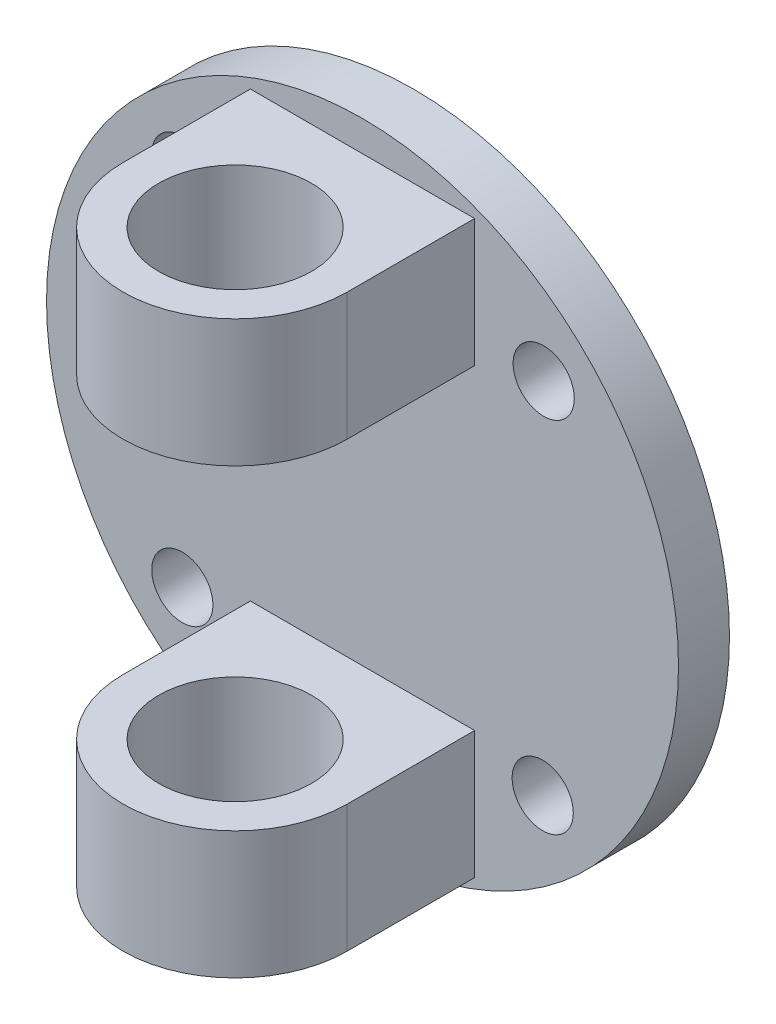
ISO-10303-21;
HEADER;
FILE_DESCRIPTION(('STEP AP214'),'2;1');
FILE_NAME('part.step','',(''),(''),'','','');
FILE_SCHEMA(('AUTOMOTIVE_DESIGN { 1 0 10303 214 1 1 1 1 }'));
ENDSEC;
DATA;
#1=APPLICATION_CONTEXT('core data for automotive mechanical design processes');
#2=APPLICATION_PROTOCOL_DEFINITION('international standard','automotive_design',2000,#1);
#3=PRODUCT_CONTEXT('',#1,'mechanical');
#4=PRODUCT('Part','Part','',(#3));
#5=PRODUCT_RELATED_PRODUCT_CATEGORY('part','',(#4));
#6=PRODUCT_DEFINITION_FORMATION('','',#4);
#7=PRODUCT_DEFINITION_CONTEXT('part definition',#1,'design');
#8=PRODUCT_DEFINITION('design','',#6,#7);
#9=PRODUCT_DEFINITION_SHAPE('','',#8);
#10=(LENGTH_UNIT() NAMED_UNIT(*) SI_UNIT(.MILLI.,.METRE.));
#11=(NAMED_UNIT(*) PLANE_ANGLE_UNIT() SI_UNIT($,.RADIAN.));
#12=(NAMED_UNIT(*) SI_UNIT($,.STERADIAN.) SOLID_ANGLE_UNIT());
#13=UNCERTAINTY_MEASURE_WITH_UNIT(LENGTH_MEASURE(1.E-05),#10,'distance_accuracy_value','');
#14=(GEOMETRIC_REPRESENTATION_CONTEXT(3) GLOBAL_UNCERTAINTY_ASSIGNED_CONTEXT((#13)) GLOBAL_UNIT_ASSIGNED_CONTEXT((#10,
#11,#12)) REPRESENTATION_CONTEXT('',''));
#15=CARTESIAN_POINT('',(0.,0.,0.));
#16=DIRECTION('',(0.,0.,1.));
#17=DIRECTION('',(1.,0.,0.));
#18=AXIS2_PLACEMENT_3D('',#15,#16,#17);
#19=CARTESIAN_POINT('',(0.,0.,10.));
#20=DIRECTION('',(0.,0.,1.));
#21=DIRECTION('',(1.,0.,0.));
#22=AXIS2_PLACEMENT_3D('',#19,#20,#21);
#23=PLANE('',#22);
#24=CARTESIAN_POINT('',(35.5489085942564,35.1607038859748,10.));
#25=DIRECTION('',(0.,0.,1.));
#26=DIRECTION('',(1.,0.,0.));
#27=AXIS2_PLACEMENT_3D('',#24,#25,#26);
#28=CIRCLE('',#27,6.);
#29=CARTESIAN_POINT('',(41.5489085942564,35.1607038859748,10.));
#30=VERTEX_POINT('',#29);
#31=EDGE_CURVE('E225',#30,#30,#28,.T.);
#32=ORIENTED_EDGE('',*,*,#31,.F.);
#33=EDGE_LOOP('',(#32));
#34=FACE_BOUND('',#33,.T.);
#35=CARTESIAN_POINT('',(-35.3553390593276,35.3553390593272,10.));
#36=DIRECTION('',(0.,0.,1.));
#37=DIRECTION('',(1.,0.,0.));
#38=AXIS2_PLACEMENT_3D('',#35,#36,#37);
#39=CIRCLE('',#38,6.);
#40=CARTESIAN_POINT('',(-29.3553390593276,35.3553390593272,10.));
#41=VERTEX_POINT('',#40);
#42=EDGE_CURVE('E217',#41,#41,#39,.T.);
#43=ORIENTED_EDGE('',*,*,#42,.F.);
#44=EDGE_LOOP('',(#43));
#45=FACE_BOUND('',#44,.T.);
#46=CARTESIAN_POINT('',(-35.3553390593271,-35.3553390593277,10.));
#47=DIRECTION('',(0.,0.,1.));
#48=DIRECTION('',(1.,0.,0.));
#49=AXIS2_PLACEMENT_3D('',#46,#47,#48);
#50=CIRCLE('',#49,6.);
#51=CARTESIAN_POINT('',(-29.3553390593271,-35.3553390593277,10.));
#52=VERTEX_POINT('',#51);
#53=EDGE_CURVE('E208',#52,#52,#50,.T.);
#54=ORIENTED_EDGE('',*,*,#53,.F.);
#55=EDGE_LOOP('',(#54));
#56=FACE_BOUND('',#55,.T.);
#57=CARTESIAN_POINT('',(35.3553390593277,-35.3553390593271,10.));
#58=DIRECTION('',(0.,0.,1.));
#59=DIRECTION('',(1.,0.,0.));
#60=AXIS2_PLACEMENT_3D('',#57,#58,#59);
#61=CIRCLE('',#60,6.);
#62=CARTESIAN_POINT('',(41.3553390593277,-35.3553390593271,10.));
#63=VERTEX_POINT('',#62);
#64=EDGE_CURVE('E212',#63,#63,#61,.T.);
#65=ORIENTED_EDGE('',*,*,#64,.F.);
#66=EDGE_LOOP('',(#65));
#67=FACE_BOUND('',#66,.T.);
#68=CARTESIAN_POINT('',(0.,0.,10.));
#69=DIRECTION('',(0.,0.,1.));
#70=DIRECTION('',(1.,0.,0.));
#71=AXIS2_PLACEMENT_3D('',#68,#69,#70);
#72=CIRCLE('',#71,62.);
#73=CARTESIAN_POINT('',(62.,0.,10.));
#74=VERTEX_POINT('',#73);
#75=EDGE_CURVE('E11',#74,#74,#72,.T.);
#76=ORIENTED_EDGE('',*,*,#75,.T.);
#77=EDGE_LOOP('',(#76));
#78=FACE_BOUND('',#77,.T.);
#79=DIRECTION('',(1.,0.,0.));
#80=VECTOR('',#79,1.);
#81=CARTESIAN_POINT('',(-22.,-56.,10.));
#82=LINE('',#81,#80);
#83=CARTESIAN_POINT('',(-22.,-56.,10.));
#84=VERTEX_POINT('',#83);
#85=CARTESIAN_POINT('',(22.,-56.,10.));
#86=VERTEX_POINT('',#85);
#87=EDGE_CURVE('E125',#84,#86,#82,.T.);
#88=ORIENTED_EDGE('',*,*,#87,.F.);
#89=DIRECTION('',(0.,-1.,0.));
#90=VECTOR('',#89,1.);
#91=CARTESIAN_POINT('',(-22.,-31.,10.));
#92=LINE('',#91,#90);
#93=CARTESIAN_POINT('',(-22.,-31.,10.));
#94=VERTEX_POINT('',#93);
#95=EDGE_CURVE('E180',#94,#84,#92,.T.);
#96=ORIENTED_EDGE('',*,*,#95,.F.);
#97=DIRECTION('',(-1.,0.,0.));
#98=VECTOR('',#97,1.);
#99=CARTESIAN_POINT('',(22.,-31.,10.));
#100=LINE('',#99,#98);
#101=CARTESIAN_POINT('',(22.,-31.,10.));
#102=VERTEX_POINT('',#101);
#103=EDGE_CURVE('E188',#102,#94,#100,.T.);
#104=ORIENTED_EDGE('',*,*,#103,.F.);
#105=DIRECTION('',(0.,1.,0.));
#106=VECTOR('',#105,1.);
#107=CARTESIAN_POINT('',(22.,-56.,10.));
#108=LINE('',#107,#106);
#109=EDGE_CURVE('E195',#86,#102,#108,.T.);
#110=ORIENTED_EDGE('',*,*,#109,.F.);
#111=EDGE_LOOP('',(#88,#96,#104,#110));
#112=FACE_BOUND('',#111,.T.);
#113=DIRECTION('',(0.,1.,0.));
#114=VECTOR('',#113,1.);
#115=CARTESIAN_POINT('',(22.,31.,10.));
#116=LINE('',#115,#114);
#117=CARTESIAN_POINT('',(22.,31.,10.));
#118=VERTEX_POINT('',#117);
#119=CARTESIAN_POINT('',(22.,56.,10.));
#120=VERTEX_POINT('',#119);
#121=EDGE_CURVE('E173',#118,#120,#116,.T.);
#122=ORIENTED_EDGE('',*,*,#121,.F.);
#123=DIRECTION('',(1.,0.,0.));
#124=VECTOR('',#123,1.);
#125=CARTESIAN_POINT('',(-22.,31.,10.));
#126=LINE('',#125,#124);
#127=CARTESIAN_POINT('',(-22.,31.,10.));
#128=VERTEX_POINT('',#127);
#129=EDGE_CURVE('E176',#128,#118,#126,.T.);
#130=ORIENTED_EDGE('',*,*,#129,.F.);
#131=DIRECTION('',(0.,-1.,0.));
#132=VECTOR('',#131,1.);
#133=CARTESIAN_POINT('',(-22.,31.,10.));
#134=LINE('',#133,#132);
#135=CARTESIAN_POINT('',(-22.,56.,10.));
#136=VERTEX_POINT('',#135);
#137=EDGE_CURVE('E166',#136,#128,#134,.T.);
#138=ORIENTED_EDGE('',*,*,#137,.F.);
#139=DIRECTION('',(-1.,0.,0.));
#140=VECTOR('',#139,1.);
#141=CARTESIAN_POINT('',(22.,56.,10.));
#142=LINE('',#141,#140);
#143=EDGE_CURVE('E169',#120,#136,#142,.T.);
#144=ORIENTED_EDGE('',*,*,#143,.F.);
#145=EDGE_LOOP('',(#122,#130,#138,#144));
#146=FACE_BOUND('',#145,.T.);
#147=ADVANCED_FACE('F42',(#34,#45,#56,#67,#78,#112,#146),#23,.T.);
#148=CARTESIAN_POINT('',(0.,0.,10.));
#149=DIRECTION('',(0.,0.,-1.));
#150=DIRECTION('',(-1.,0.,0.));
#151=AXIS2_PLACEMENT_3D('',#148,#149,#150);
#152=CYLINDRICAL_SURFACE('',#151,62.);
#153=ORIENTED_EDGE('',*,*,#75,.F.);
#154=EDGE_LOOP('',(#153));
#155=FACE_BOUND('',#154,.T.);
#156=CARTESIAN_POINT('',(0.,0.,0.));
#157=DIRECTION('',(0.,0.,1.));
#158=DIRECTION('',(1.,0.,0.));
#159=AXIS2_PLACEMENT_3D('',#156,#157,#158);
#160=CIRCLE('',#159,62.);
#161=CARTESIAN_POINT('',(62.,0.,0.));
#162=VERTEX_POINT('',#161);
#163=EDGE_CURVE('E46',#162,#162,#160,.T.);
#164=ORIENTED_EDGE('',*,*,#163,.T.);
#165=EDGE_LOOP('',(#164));
#166=FACE_BOUND('',#165,.T.);
#167=ADVANCED_FACE('F44',(#155,#166),#152,.T.);
#168=CARTESIAN_POINT('',(0.,0.,0.));
#169=DIRECTION('',(0.,0.,1.));
#170=DIRECTION('',(1.,0.,0.));
#171=AXIS2_PLACEMENT_3D('',#168,#169,#170);
#172=PLANE('',#171);
#173=CARTESIAN_POINT('',(35.5489085942564,35.1607038859748,0.));
#174=DIRECTION('',(0.,0.,1.));
#175=DIRECTION('',(1.,0.,0.));
#176=AXIS2_PLACEMENT_3D('',#173,#174,#175);
#177=CIRCLE('',#176,6.);
#178=CARTESIAN_POINT('',(41.5489085942564,35.1607038859748,0.));
#179=VERTEX_POINT('',#178);
#180=EDGE_CURVE('E207',#179,#179,#177,.T.);
#181=ORIENTED_EDGE('',*,*,#180,.T.);
#182=EDGE_LOOP('',(#181));
#183=FACE_BOUND('',#182,.T.);
#184=CARTESIAN_POINT('',(-35.3553390593276,35.3553390593272,0.));
#185=DIRECTION('',(0.,0.,1.));
#186=DIRECTION('',(1.,0.,0.));
#187=AXIS2_PLACEMENT_3D('',#184,#185,#186);
#188=CIRCLE('',#187,6.);
#189=CARTESIAN_POINT('',(-29.3553390593276,35.3553390593272,0.));
#190=VERTEX_POINT('',#189);
#191=EDGE_CURVE('E221',#190,#190,#188,.T.);
#192=ORIENTED_EDGE('',*,*,#191,.T.);
#193=EDGE_LOOP('',(#192));
#194=FACE_BOUND('',#193,.T.);
#195=CARTESIAN_POINT('',(-35.3553390593271,-35.3553390593277,0.));
#196=DIRECTION('',(0.,0.,1.));
#197=DIRECTION('',(1.,0.,0.));
#198=AXIS2_PLACEMENT_3D('',#195,#196,#197);
#199=CIRCLE('',#198,6.);
#200=CARTESIAN_POINT('',(-29.3553390593271,-35.3553390593277,0.));
#201=VERTEX_POINT('',#200);
#202=EDGE_CURVE('E213',#201,#201,#199,.T.);
#203=ORIENTED_EDGE('',*,*,#202,.T.);
#204=EDGE_LOOP('',(#203));
#205=FACE_BOUND('',#204,.T.);
#206=CARTESIAN_POINT('',(35.3553390593277,-35.3553390593271,0.));
#207=DIRECTION('',(0.,0.,1.));
#208=DIRECTION('',(1.,0.,0.));
#209=AXIS2_PLACEMENT_3D('',#206,#207,#208);
#210=CIRCLE('',#209,6.);
#211=CARTESIAN_POINT('',(41.3553390593277,-35.3553390593271,0.));
#212=VERTEX_POINT('',#211);
#213=EDGE_CURVE('E232',#212,#212,#210,.T.);
#214=ORIENTED_EDGE('',*,*,#213,.T.);
#215=EDGE_LOOP('',(#214));
#216=FACE_BOUND('',#215,.T.);
#217=ORIENTED_EDGE('',*,*,#163,.F.);
#218=EDGE_LOOP('',(#217));
#219=FACE_BOUND('',#218,.T.);
#220=ADVANCED_FACE('F303',(#183,#194,#205,#216,#219),#172,.F.);
#221=CARTESIAN_POINT('',(35.3553390593277,-35.3553390593271,0.));
#222=DIRECTION('',(0.,0.,1.));
#223=DIRECTION('',(1.,0.,0.));
#224=AXIS2_PLACEMENT_3D('',#221,#222,#223);
#225=CYLINDRICAL_SURFACE('',#224,6.);
#226=ORIENTED_EDGE('',*,*,#213,.F.);
#227=EDGE_LOOP('',(#226));
#228=FACE_BOUND('',#227,.T.);
#229=ORIENTED_EDGE('',*,*,#64,.T.);
#230=EDGE_LOOP('',(#229));
#231=FACE_BOUND('',#230,.T.);
#232=ADVANCED_FACE('F240',(#228,#231),#225,.F.);
#233=CARTESIAN_POINT('',(-35.3553390593271,-35.3553390593277,0.));
#234=DIRECTION('',(0.,0.,1.));
#235=DIRECTION('',(1.,0.,0.));
#236=AXIS2_PLACEMENT_3D('',#233,#234,#235);
#237=CYLINDRICAL_SURFACE('',#236,6.);
#238=ORIENTED_EDGE('',*,*,#202,.F.);
#239=EDGE_LOOP('',(#238));
#240=FACE_BOUND('',#239,.T.);
#241=ORIENTED_EDGE('',*,*,#53,.T.);
#242=EDGE_LOOP('',(#241));
#243=FACE_BOUND('',#242,.T.);
#244=ADVANCED_FACE('F291',(#240,#243),#237,.F.);
#245=CARTESIAN_POINT('',(-35.3553390593276,35.3553390593272,0.));
#246=DIRECTION('',(0.,0.,1.));
#247=DIRECTION('',(1.,0.,0.));
#248=AXIS2_PLACEMENT_3D('',#245,#246,#247);
#249=CYLINDRICAL_SURFACE('',#248,6.);
#250=ORIENTED_EDGE('',*,*,#191,.F.);
#251=EDGE_LOOP('',(#250));
#252=FACE_BOUND('',#251,.T.);
#253=ORIENTED_EDGE('',*,*,#42,.T.);
#254=EDGE_LOOP('',(#253));
#255=FACE_BOUND('',#254,.T.);
#256=ADVANCED_FACE('F294',(#252,#255),#249,.F.);
#257=CARTESIAN_POINT('',(35.5489085942564,35.1607038859748,0.));
#258=DIRECTION('',(0.,0.,1.));
#259=DIRECTION('',(1.,0.,0.));
#260=AXIS2_PLACEMENT_3D('',#257,#258,#259);
#261=CYLINDRICAL_SURFACE('',#260,6.);
#262=ORIENTED_EDGE('',*,*,#180,.F.);
#263=EDGE_LOOP('',(#262));
#264=FACE_BOUND('',#263,.T.);
#265=ORIENTED_EDGE('',*,*,#31,.T.);
#266=EDGE_LOOP('',(#265));
#267=FACE_BOUND('',#266,.T.);
#268=ADVANCED_FACE('F289',(#264,#267),#261,.F.);
#269=CARTESIAN_POINT('',(-22.,-31.,35.));
#270=DIRECTION('',(1.,0.,0.));
#271=DIRECTION('',(0.,0.,-1.));
#272=AXIS2_PLACEMENT_3D('',#269,#270,#271);
#273=PLANE('',#272);
#274=ORIENTED_EDGE('',*,*,#95,.T.);
#275=DIRECTION('',(0.,0.,-1.));
#276=VECTOR('',#275,1.);
#277=CARTESIAN_POINT('',(-22.,-56.,35.));
#278=LINE('',#277,#276);
#279=CARTESIAN_POINT('',(-22.,-56.,35.));
#280=VERTEX_POINT('',#279);
#281=EDGE_CURVE('E127',#280,#84,#278,.T.);
#282=ORIENTED_EDGE('',*,*,#281,.F.);
#283=DIRECTION('',(0.,-1.,0.));
#284=VECTOR('',#283,1.);
#285=CARTESIAN_POINT('',(-22.,-31.,35.));
#286=LINE('',#285,#284);
#287=CARTESIAN_POINT('',(-22.,-31.,35.));
#288=VERTEX_POINT('',#287);
#289=EDGE_CURVE('E118',#288,#280,#286,.T.);
#290=ORIENTED_EDGE('',*,*,#289,.F.);
#291=DIRECTION('',(0.,0.,-1.));
#292=VECTOR('',#291,1.);
#293=CARTESIAN_POINT('',(-22.,-31.,35.));
#294=LINE('',#293,#292);
#295=EDGE_CURVE('E117',#288,#94,#294,.T.);
#296=ORIENTED_EDGE('',*,*,#295,.T.);
#297=EDGE_LOOP('',(#274,#282,#290,#296));
#298=FACE_BOUND('',#297,.T.);
#299=ADVANCED_FACE('F285',(#298),#273,.F.);
#300=CARTESIAN_POINT('',(-22.,-56.,35.));
#301=DIRECTION('',(0.,1.,0.));
#302=DIRECTION('',(0.,0.,1.));
#303=AXIS2_PLACEMENT_3D('',#300,#301,#302);
#304=PLANE('',#303);
#305=CARTESIAN_POINT('',(0.,-56.,35.));
#306=DIRECTION('',(0.,-1.,0.));
#307=DIRECTION('',(0.,0.,-1.));
#308=AXIS2_PLACEMENT_3D('',#305,#306,#307);
#309=CIRCLE('',#308,15.);
#310=CARTESIAN_POINT('',(0.,-56.,20.));
#311=VERTEX_POINT('',#310);
#312=EDGE_CURVE('E511',#311,#311,#309,.T.);
#313=ORIENTED_EDGE('',*,*,#312,.F.);
#314=EDGE_LOOP('',(#313));
#315=FACE_BOUND('',#314,.T.);
#316=ORIENTED_EDGE('',*,*,#87,.T.);
#317=DIRECTION('',(0.,0.,-1.));
#318=VECTOR('',#317,1.);
#319=CARTESIAN_POINT('',(22.,-56.,35.));
#320=LINE('',#319,#318);
#321=CARTESIAN_POINT('',(22.,-56.,35.));
#322=VERTEX_POINT('',#321);
#323=EDGE_CURVE('E111',#322,#86,#320,.T.);
#324=ORIENTED_EDGE('',*,*,#323,.F.);
#325=CARTESIAN_POINT('',(0.,-56.,35.));
#326=DIRECTION('',(0.,-1.,0.));
#327=DIRECTION('',(0.,0.,-1.));
#328=AXIS2_PLACEMENT_3D('',#325,#326,#327);
#329=CIRCLE('',#328,22.);
#330=EDGE_CURVE('E123',#322,#280,#329,.T.);
#331=ORIENTED_EDGE('',*,*,#330,.T.);
#332=ORIENTED_EDGE('',*,*,#281,.T.);
#333=EDGE_LOOP('',(#316,#324,#331,#332));
#334=FACE_BOUND('',#333,.T.);
#335=ADVANCED_FACE('F122',(#315,#334),#304,.F.);
#336=CARTESIAN_POINT('',(22.,-56.,35.));
#337=DIRECTION('',(-1.,0.,0.));
#338=DIRECTION('',(0.,0.,1.));
#339=AXIS2_PLACEMENT_3D('',#336,#337,#338);
#340=PLANE('',#339);
#341=ORIENTED_EDGE('',*,*,#109,.T.);
#342=DIRECTION('',(0.,0.,-1.));
#343=VECTOR('',#342,1.);
#344=CARTESIAN_POINT('',(22.,-31.,35.));
#345=LINE('',#344,#343);
#346=CARTESIAN_POINT('',(22.,-31.,35.));
#347=VERTEX_POINT('',#346);
#348=EDGE_CURVE('E66',#347,#102,#345,.T.);
#349=ORIENTED_EDGE('',*,*,#348,.F.);
#350=DIRECTION('',(0.,1.,0.));
#351=VECTOR('',#350,1.);
#352=CARTESIAN_POINT('',(22.,-56.,35.));
#353=LINE('',#352,#351);
#354=EDGE_CURVE('E108',#322,#347,#353,.T.);
#355=ORIENTED_EDGE('',*,*,#354,.F.);
#356=ORIENTED_EDGE('',*,*,#323,.T.);
#357=EDGE_LOOP('',(#341,#349,#355,#356));
#358=FACE_BOUND('',#357,.T.);
#359=ADVANCED_FACE('F110',(#358),#340,.F.);
#360=CARTESIAN_POINT('',(22.,-31.,35.));
#361=DIRECTION('',(0.,-1.,0.));
#362=DIRECTION('',(1.,0.,0.));
#363=AXIS2_PLACEMENT_3D('',#360,#361,#362);
#364=PLANE('',#363);
#365=CARTESIAN_POINT('',(0.,-31.,35.));
#366=DIRECTION('',(0.,-1.,0.));
#367=DIRECTION('',(0.,0.,-1.));
#368=AXIS2_PLACEMENT_3D('',#365,#366,#367);
#369=CIRCLE('',#368,15.);
#370=CARTESIAN_POINT('',(0.,-31.,20.));
#371=VERTEX_POINT('',#370);
#372=EDGE_CURVE('E508',#371,#371,#369,.T.);
#373=ORIENTED_EDGE('',*,*,#372,.T.);
#374=EDGE_LOOP('',(#373));
#375=FACE_BOUND('',#374,.T.);
#376=ORIENTED_EDGE('',*,*,#103,.T.);
#377=ORIENTED_EDGE('',*,*,#295,.F.);
#378=CARTESIAN_POINT('',(0.,-31.,35.));
#379=DIRECTION('',(0.,-1.,0.));
#380=DIRECTION('',(0.,0.,-1.));
#381=AXIS2_PLACEMENT_3D('',#378,#379,#380);
#382=CIRCLE('',#381,22.);
#383=EDGE_CURVE('E133',#347,#288,#382,.T.);
#384=ORIENTED_EDGE('',*,*,#383,.F.);
#385=ORIENTED_EDGE('',*,*,#348,.T.);
#386=EDGE_LOOP('',(#376,#377,#384,#385));
#387=FACE_BOUND('',#386,.T.);
#388=ADVANCED_FACE('F277',(#375,#387),#364,.F.);
#389=CARTESIAN_POINT('',(-22.,31.,35.));
#390=DIRECTION('',(0.,1.,0.));
#391=DIRECTION('',(0.,0.,1.));
#392=AXIS2_PLACEMENT_3D('',#389,#390,#391);
#393=PLANE('',#392);
#394=CARTESIAN_POINT('',(0.,31.,35.));
#395=DIRECTION('',(0.,1.,0.));
#396=DIRECTION('',(0.,0.,1.));
#397=AXIS2_PLACEMENT_3D('',#394,#395,#396);
#398=CIRCLE('',#397,15.);
#399=CARTESIAN_POINT('',(0.,31.,50.));
#400=VERTEX_POINT('',#399);
#401=EDGE_CURVE('E134',#400,#400,#398,.T.);
#402=ORIENTED_EDGE('',*,*,#401,.T.);
#403=EDGE_LOOP('',(#402));
#404=FACE_BOUND('',#403,.T.);
#405=ORIENTED_EDGE('',*,*,#129,.T.);
#406=DIRECTION('',(0.,0.,-1.));
#407=VECTOR('',#406,1.);
#408=CARTESIAN_POINT('',(22.,31.,35.));
#409=LINE('',#408,#407);
#410=CARTESIAN_POINT('',(22.,31.,35.));
#411=VERTEX_POINT('',#410);
#412=EDGE_CURVE('E149',#411,#118,#409,.T.);
#413=ORIENTED_EDGE('',*,*,#412,.F.);
#414=CARTESIAN_POINT('',(0.,31.,35.));
#415=DIRECTION('',(0.,1.,0.));
#416=DIRECTION('',(0.,0.,1.));
#417=AXIS2_PLACEMENT_3D('',#414,#415,#416);
#418=CIRCLE('',#417,22.);
#419=CARTESIAN_POINT('',(-22.,31.,35.));
#420=VERTEX_POINT('',#419);
#421=EDGE_CURVE('E145',#420,#411,#418,.T.);
#422=ORIENTED_EDGE('',*,*,#421,.F.);
#423=DIRECTION('',(0.,0.,-1.));
#424=VECTOR('',#423,1.);
#425=CARTESIAN_POINT('',(-22.,31.,35.));
#426=LINE('',#425,#424);
#427=EDGE_CURVE('E161',#420,#128,#426,.T.);
#428=ORIENTED_EDGE('',*,*,#427,.T.);
#429=EDGE_LOOP('',(#405,#413,#422,#428));
#430=FACE_BOUND('',#429,.T.);
#431=ADVANCED_FACE('F264',(#404,#430),#393,.F.);
#432=CARTESIAN_POINT('',(22.,31.,35.));
#433=DIRECTION('',(-1.,0.,0.));
#434=DIRECTION('',(0.,0.,1.));
#435=AXIS2_PLACEMENT_3D('',#432,#433,#434);
#436=PLANE('',#435);
#437=ORIENTED_EDGE('',*,*,#121,.T.);
#438=DIRECTION('',(0.,0.,-1.));
#439=VECTOR('',#438,1.);
#440=CARTESIAN_POINT('',(22.,56.,35.));
#441=LINE('',#440,#439);
#442=CARTESIAN_POINT('',(22.,56.,35.));
#443=VERTEX_POINT('',#442);
#444=EDGE_CURVE('E155',#443,#120,#441,.T.);
#445=ORIENTED_EDGE('',*,*,#444,.F.);
#446=DIRECTION('',(0.,1.,0.));
#447=VECTOR('',#446,1.);
#448=CARTESIAN_POINT('',(22.,31.,35.));
#449=LINE('',#448,#447);
#450=EDGE_CURVE('E170',#411,#443,#449,.T.);
#451=ORIENTED_EDGE('',*,*,#450,.F.);
#452=ORIENTED_EDGE('',*,*,#412,.T.);
#453=EDGE_LOOP('',(#437,#445,#451,#452));
#454=FACE_BOUND('',#453,.T.);
#455=ADVANCED_FACE('F255',(#454),#436,.F.);
#456=CARTESIAN_POINT('',(22.,56.,35.));
#457=DIRECTION('',(0.,-1.,0.));
#458=DIRECTION('',(0.,0.,-1.));
#459=AXIS2_PLACEMENT_3D('',#456,#457,#458);
#460=PLANE('',#459);
#461=CARTESIAN_POINT('',(0.,56.,35.));
#462=DIRECTION('',(0.,1.,0.));
#463=DIRECTION('',(0.,0.,1.));
#464=AXIS2_PLACEMENT_3D('',#461,#462,#463);
#465=CIRCLE('',#464,15.);
#466=CARTESIAN_POINT('',(0.,56.,50.));
#467=VERTEX_POINT('',#466);
#468=EDGE_CURVE('E141',#467,#467,#465,.T.);
#469=ORIENTED_EDGE('',*,*,#468,.F.);
#470=EDGE_LOOP('',(#469));
#471=FACE_BOUND('',#470,.T.);
#472=ORIENTED_EDGE('',*,*,#143,.T.);
#473=DIRECTION('',(0.,0.,-1.));
#474=VECTOR('',#473,1.);
#475=CARTESIAN_POINT('',(-22.,56.,35.));
#476=LINE('',#475,#474);
#477=CARTESIAN_POINT('',(-22.,56.,35.));
#478=VERTEX_POINT('',#477);
#479=EDGE_CURVE('E58',#478,#136,#476,.T.);
#480=ORIENTED_EDGE('',*,*,#479,.F.);
#481=CARTESIAN_POINT('',(0.,56.,35.));
#482=DIRECTION('',(0.,1.,0.));
#483=DIRECTION('',(0.,0.,1.));
#484=AXIS2_PLACEMENT_3D('',#481,#482,#483);
#485=CIRCLE('',#484,22.);
#486=EDGE_CURVE('E138',#478,#443,#485,.T.);
#487=ORIENTED_EDGE('',*,*,#486,.T.);
#488=ORIENTED_EDGE('',*,*,#444,.T.);
#489=EDGE_LOOP('',(#472,#480,#487,#488));
#490=FACE_BOUND('',#489,.T.);
#491=ADVANCED_FACE('F258',(#471,#490),#460,.F.);
#492=CARTESIAN_POINT('',(-22.,31.,35.));
#493=DIRECTION('',(1.,0.,0.));
#494=DIRECTION('',(0.,1.,0.));
#495=AXIS2_PLACEMENT_3D('',#492,#493,#494);
#496=PLANE('',#495);
#497=ORIENTED_EDGE('',*,*,#137,.T.);
#498=ORIENTED_EDGE('',*,*,#427,.F.);
#499=DIRECTION('',(0.,-1.,0.));
#500=VECTOR('',#499,1.);
#501=CARTESIAN_POINT('',(-22.,31.,35.));
#502=LINE('',#501,#500);
#503=EDGE_CURVE('E165',#478,#420,#502,.T.);
#504=ORIENTED_EDGE('',*,*,#503,.F.);
#505=ORIENTED_EDGE('',*,*,#479,.T.);
#506=EDGE_LOOP('',(#497,#498,#504,#505));
#507=FACE_BOUND('',#506,.T.);
#508=ADVANCED_FACE('F265',(#507),#496,.F.);
#509=CARTESIAN_POINT('',(0.,31.,35.));
#510=DIRECTION('',(0.,1.,0.));
#511=DIRECTION('',(0.,0.,1.));
#512=AXIS2_PLACEMENT_3D('',#509,#510,#511);
#513=CYLINDRICAL_SURFACE('',#512,22.);
#514=ORIENTED_EDGE('',*,*,#486,.F.);
#515=ORIENTED_EDGE('',*,*,#503,.T.);
#516=ORIENTED_EDGE('',*,*,#421,.T.);
#517=ORIENTED_EDGE('',*,*,#450,.T.);
#518=EDGE_LOOP('',(#514,#515,#516,#517));
#519=FACE_BOUND('',#518,.T.);
#520=ADVANCED_FACE('F261',(#519),#513,.T.);
#521=CARTESIAN_POINT('',(0.,-31.,35.));
#522=DIRECTION('',(0.,-1.,0.));
#523=DIRECTION('',(0.,0.,-1.));
#524=AXIS2_PLACEMENT_3D('',#521,#522,#523);
#525=CYLINDRICAL_SURFACE('',#524,22.);
#526=ORIENTED_EDGE('',*,*,#330,.F.);
#527=ORIENTED_EDGE('',*,*,#354,.T.);
#528=ORIENTED_EDGE('',*,*,#383,.T.);
#529=ORIENTED_EDGE('',*,*,#289,.T.);
#530=EDGE_LOOP('',(#526,#527,#528,#529));
#531=FACE_BOUND('',#530,.T.);
#532=ADVANCED_FACE('F130',(#531),#525,.T.);
#533=CARTESIAN_POINT('',(0.,31.,35.));
#534=DIRECTION('',(0.,1.,0.));
#535=DIRECTION('',(0.,0.,1.));
#536=AXIS2_PLACEMENT_3D('',#533,#534,#535);
#537=CYLINDRICAL_SURFACE('',#536,15.);
#538=CARTESIAN_POINT('',(0.,31.,50.));
#539=CARTESIAN_POINT('',(0.,31.2604166666667,50.));
#540=CARTESIAN_POINT('',(0.,31.5208333333333,50.));
#541=CARTESIAN_POINT('',(0.,32.0416666666667,50.));
#542=CARTESIAN_POINT('',(0.,32.3020833333333,50.));
#543=CARTESIAN_POINT('',(0.,32.8229166666667,50.));
#544=CARTESIAN_POINT('',(0.,33.0833333333333,50.));
#545=CARTESIAN_POINT('',(0.,33.6041666666667,50.));
#546=CARTESIAN_POINT('',(0.,33.8645833333333,50.));
#547=CARTESIAN_POINT('',(0.,34.3854166666667,50.));
#548=CARTESIAN_POINT('',(0.,34.6458333333333,50.));
#549=CARTESIAN_POINT('',(0.,35.1666666666667,50.));
#550=CARTESIAN_POINT('',(0.,35.4270833333333,50.));
#551=CARTESIAN_POINT('',(0.,35.9479166666667,50.));
#552=CARTESIAN_POINT('',(0.,36.2083333333333,50.));
#553=CARTESIAN_POINT('',(0.,36.7291666666667,50.));
#554=CARTESIAN_POINT('',(0.,36.9895833333333,50.));
#555=CARTESIAN_POINT('',(0.,37.5104166666667,50.));
#556=CARTESIAN_POINT('',(0.,37.7708333333333,50.));
#557=CARTESIAN_POINT('',(0.,38.2916666666667,50.));
#558=CARTESIAN_POINT('',(0.,38.5520833333333,50.));
#559=CARTESIAN_POINT('',(0.,39.0729166666667,50.));
#560=CARTESIAN_POINT('',(0.,39.3333333333333,50.));
#561=CARTESIAN_POINT('',(0.,39.8541666666667,50.));
#562=CARTESIAN_POINT('',(0.,40.1145833333333,50.));
#563=CARTESIAN_POINT('',(0.,40.6354166666667,50.));
#564=CARTESIAN_POINT('',(0.,40.8958333333333,50.));
#565=CARTESIAN_POINT('',(0.,41.4166666666667,50.));
#566=CARTESIAN_POINT('',(0.,41.6770833333333,50.));
#567=CARTESIAN_POINT('',(0.,42.1979166666667,50.));
#568=CARTESIAN_POINT('',(0.,42.4583333333333,50.));
#569=CARTESIAN_POINT('',(0.,42.9791666666667,50.));
#570=CARTESIAN_POINT('',(0.,43.2395833333333,50.));
#571=CARTESIAN_POINT('',(0.,43.7604166666667,50.));
#572=CARTESIAN_POINT('',(0.,44.0208333333333,50.));
#573=CARTESIAN_POINT('',(0.,44.5416666666667,50.));
#574=CARTESIAN_POINT('',(0.,44.8020833333333,50.));
#575=CARTESIAN_POINT('',(0.,45.3229166666667,50.));
#576=CARTESIAN_POINT('',(0.,45.5833333333333,50.));
#577=CARTESIAN_POINT('',(0.,46.1041666666667,50.));
#578=CARTESIAN_POINT('',(0.,46.3645833333333,50.));
#579=CARTESIAN_POINT('',(0.,46.8854166666667,50.));
#580=CARTESIAN_POINT('',(0.,47.1458333333333,50.));
#581=CARTESIAN_POINT('',(0.,47.6666666666667,50.));
#582=CARTESIAN_POINT('',(0.,47.9270833333333,50.));
#583=CARTESIAN_POINT('',(0.,48.4479166666667,50.));
#584=CARTESIAN_POINT('',(0.,48.7083333333333,50.));
#585=CARTESIAN_POINT('',(0.,49.2291666666667,50.));
#586=CARTESIAN_POINT('',(0.,49.4895833333333,50.));
#587=CARTESIAN_POINT('',(0.,50.0104166666667,50.));
#588=CARTESIAN_POINT('',(0.,50.2708333333333,50.));
#589=CARTESIAN_POINT('',(0.,50.7916666666667,50.));
#590=CARTESIAN_POINT('',(0.,51.0520833333333,50.));
#591=CARTESIAN_POINT('',(0.,51.5729166666667,50.));
#592=CARTESIAN_POINT('',(0.,51.8333333333333,50.));
#593=CARTESIAN_POINT('',(0.,52.3541666666667,50.));
#594=CARTESIAN_POINT('',(0.,52.6145833333333,50.));
#595=CARTESIAN_POINT('',(0.,53.1354166666667,50.));
#596=CARTESIAN_POINT('',(0.,53.3958333333333,50.));
#597=CARTESIAN_POINT('',(0.,53.9166666666667,50.));
#598=CARTESIAN_POINT('',(0.,54.1770833333333,50.));
#599=CARTESIAN_POINT('',(0.,54.6979166666667,50.));
#600=CARTESIAN_POINT('',(0.,54.9583333333333,50.));
#601=CARTESIAN_POINT('',(0.,55.4791666666667,50.));
#602=CARTESIAN_POINT('',(0.,55.7395833333333,50.));
#603=CARTESIAN_POINT('',(0.,56.,50.));
#604=B_SPLINE_CURVE_WITH_KNOTS('',3,(#538,#539,#540,#541,#542,#543,#544,#545,#546,#547,#548,
#549,#550,#551,#552,#553,#554,#555,#556,#557,#558,#559,#560,#561,#562,#563,#564,#565,#566,#567,
#568,#569,#570,#571,#572,#573,#574,#575,#576,#577,#578,#579,#580,#581,#582,#583,#584,#585,#586,
#587,#588,#589,#590,#591,#592,#593,#594,#595,#596,#597,#598,#599,#600,#601,#602,#603),
.UNSPECIFIED.,.F.,.F.,(4,2,2,2,2,2,2,2,2,2,2,2,2,2,2,2,2,2,2,2,2,2,2,2,2,2,2,2,2,2,2,2,4),(0.,
0.781250000000001,1.5625,2.34375,3.125,3.90625,4.6875,5.46875,6.25,7.03125,7.8125,8.59375,
9.37500000000001,10.15625,10.9375,11.71875,12.5,13.28125,14.0625,14.84375,15.625,16.40625,
17.1875,17.96875,18.75,19.53125,20.3125,21.09375,21.875,22.65625,23.4375,24.21875,25.),.UNSPECIFIED.);
#605=EDGE_CURVE('BSEAM393',#400,#467,#604,.T.);
#606=ORIENTED_EDGE('',*,*,#401,.F.);
#607=ORIENTED_EDGE('',*,*,#468,.T.);
#608=ORIENTED_EDGE('',*,*,#605,.T.);
#609=ORIENTED_EDGE('',*,*,#605,.F.);
#610=EDGE_LOOP('',(#606,#608,#607,#609));
#611=FACE_BOUND('',#610,.T.);
#612=ADVANCED_FACE('F393',(#611),#537,.F.);
#613=CARTESIAN_POINT('',(0.,-31.,35.));
#614=DIRECTION('',(0.,-1.,0.));
#615=DIRECTION('',(0.,0.,-1.));
#616=AXIS2_PLACEMENT_3D('',#613,#614,#615);
#617=CYLINDRICAL_SURFACE('',#616,15.);
#618=CARTESIAN_POINT('',(0.,-31.,20.));
#619=CARTESIAN_POINT('',(0.,-31.2604166666667,20.));
#620=CARTESIAN_POINT('',(0.,-31.5208333333333,20.));
#621=CARTESIAN_POINT('',(0.,-32.0416666666667,20.));
#622=CARTESIAN_POINT('',(0.,-32.3020833333333,20.));
#623=CARTESIAN_POINT('',(0.,-32.8229166666667,20.));
#624=CARTESIAN_POINT('',(0.,-33.0833333333333,20.));
#625=CARTESIAN_POINT('',(0.,-33.6041666666667,20.));
#626=CARTESIAN_POINT('',(0.,-33.8645833333333,20.));
#627=CARTESIAN_POINT('',(0.,-34.3854166666667,20.));
#628=CARTESIAN_POINT('',(0.,-34.6458333333333,20.));
#629=CARTESIAN_POINT('',(0.,-35.1666666666667,20.));
#630=CARTESIAN_POINT('',(0.,-35.4270833333333,20.));
#631=CARTESIAN_POINT('',(0.,-35.9479166666667,20.));
#632=CARTESIAN_POINT('',(0.,-36.2083333333333,20.));
#633=CARTESIAN_POINT('',(0.,-36.7291666666667,20.));
#634=CARTESIAN_POINT('',(0.,-36.9895833333333,20.));
#635=CARTESIAN_POINT('',(0.,-37.5104166666667,20.));
#636=CARTESIAN_POINT('',(0.,-37.7708333333333,20.));
#637=CARTESIAN_POINT('',(0.,-38.2916666666667,20.));
#638=CARTESIAN_POINT('',(0.,-38.5520833333333,20.));
#639=CARTESIAN_POINT('',(0.,-39.0729166666667,20.));
#640=CARTESIAN_POINT('',(0.,-39.3333333333333,20.));
#641=CARTESIAN_POINT('',(0.,-39.8541666666667,20.));
#642=CARTESIAN_POINT('',(0.,-40.1145833333333,20.));
#643=CARTESIAN_POINT('',(0.,-40.6354166666667,20.));
#644=CARTESIAN_POINT('',(0.,-40.8958333333333,20.));
#645=CARTESIAN_POINT('',(0.,-41.4166666666667,20.));
#646=CARTESIAN_POINT('',(0.,-41.6770833333333,20.));
#647=CARTESIAN_POINT('',(0.,-42.1979166666667,20.));
#648=CARTESIAN_POINT('',(0.,-42.4583333333333,20.));
#649=CARTESIAN_POINT('',(0.,-42.9791666666667,20.));
#650=CARTESIAN_POINT('',(0.,-43.2395833333333,20.));
#651=CARTESIAN_POINT('',(0.,-43.7604166666667,20.));
#652=CARTESIAN_POINT('',(0.,-44.0208333333333,20.));
#653=CARTESIAN_POINT('',(0.,-44.5416666666667,20.));
#654=CARTESIAN_POINT('',(0.,-44.8020833333333,20.));
#655=CARTESIAN_POINT('',(0.,-45.3229166666667,20.));
#656=CARTESIAN_POINT('',(0.,-45.5833333333333,20.));
#657=CARTESIAN_POINT('',(0.,-46.1041666666667,20.));
#658=CARTESIAN_POINT('',(0.,-46.3645833333333,20.));
#659=CARTESIAN_POINT('',(0.,-46.8854166666667,20.));
#660=CARTESIAN_POINT('',(0.,-47.1458333333333,20.));
#661=CARTESIAN_POINT('',(0.,-47.6666666666667,20.));
#662=CARTESIAN_POINT('',(0.,-47.9270833333333,20.));
#663=CARTESIAN_POINT('',(0.,-48.4479166666667,20.));
#664=CARTESIAN_POINT('',(0.,-48.7083333333333,20.));
#665=CARTESIAN_POINT('',(0.,-49.2291666666667,20.));
#666=CARTESIAN_POINT('',(0.,-49.4895833333333,20.));
#667=CARTESIAN_POINT('',(0.,-50.0104166666667,20.));
#668=CARTESIAN_POINT('',(0.,-50.2708333333333,20.));
#669=CARTESIAN_POINT('',(0.,-50.7916666666667,20.));
#670=CARTESIAN_POINT('',(0.,-51.0520833333333,20.));
#671=CARTESIAN_POINT('',(0.,-51.5729166666667,20.));
#672=CARTESIAN_POINT('',(0.,-51.8333333333333,20.));
#673=CARTESIAN_POINT('',(0.,-52.3541666666667,20.));
#674=CARTESIAN_POINT('',(0.,-52.6145833333333,20.));
#675=CARTESIAN_POINT('',(0.,-53.1354166666667,20.));
#676=CARTESIAN_POINT('',(0.,-53.3958333333333,20.));
#677=CARTESIAN_POINT('',(0.,-53.9166666666667,20.));
#678=CARTESIAN_POINT('',(0.,-54.1770833333333,20.));
#679=CARTESIAN_POINT('',(0.,-54.6979166666667,20.));
#680=CARTESIAN_POINT('',(0.,-54.9583333333333,20.));
#681=CARTESIAN_POINT('',(0.,-55.4791666666667,20.));
#682=CARTESIAN_POINT('',(0.,-55.7395833333333,20.));
#683=CARTESIAN_POINT('',(0.,-56.,20.));
#684=B_SPLINE_CURVE_WITH_KNOTS('',3,(#618,#619,#620,#621,#622,#623,#624,#625,#626,#627,#628,
#629,#630,#631,#632,#633,#634,#635,#636,#637,#638,#639,#640,#641,#642,#643,#644,#645,#646,#647,
#648,#649,#650,#651,#652,#653,#654,#655,#656,#657,#658,#659,#660,#661,#662,#663,#664,#665,#666,
#667,#668,#669,#670,#671,#672,#673,#674,#675,#676,#677,#678,#679,#680,#681,#682,#683),
.UNSPECIFIED.,.F.,.F.,(4,2,2,2,2,2,2,2,2,2,2,2,2,2,2,2,2,2,2,2,2,2,2,2,2,2,2,2,2,2,2,2,4),(0.,
0.781250000000001,1.5625,2.34375,3.125,3.90625,4.6875,5.46875,6.25,7.03125,7.8125,8.59375,
9.37500000000001,10.15625,10.9375,11.71875,12.5,13.28125,14.0625,14.84375,15.625,16.40625,
17.1875,17.96875,18.75,19.53125,20.3125,21.09375,21.875,22.65625,23.4375,24.21875,25.),.UNSPECIFIED.);
#685=EDGE_CURVE('BSEAM416',#371,#311,#684,.T.);
#686=ORIENTED_EDGE('',*,*,#372,.F.);
#687=ORIENTED_EDGE('',*,*,#312,.T.);
#688=ORIENTED_EDGE('',*,*,#685,.T.);
#689=ORIENTED_EDGE('',*,*,#685,.F.);
#690=EDGE_LOOP('',(#686,#688,#687,#689));
#691=FACE_BOUND('',#690,.T.);
#692=ADVANCED_FACE('F416',(#691),#617,.F.);
#693=CLOSED_SHELL('',(#147,#167,#220,#232,#244,#256,#268,#299,#335,#359,#388,#431,#455,#491,
#508,#520,#532,#612,#692));
#694=MANIFOLD_SOLID_BREP('B2',#693);
#695=ADVANCED_BREP_SHAPE_REPRESENTATION('',(#18,#694),#14);
#696=SHAPE_DEFINITION_REPRESENTATION(#9,#695);
ENDSEC;
END-ISO-10303-21;
